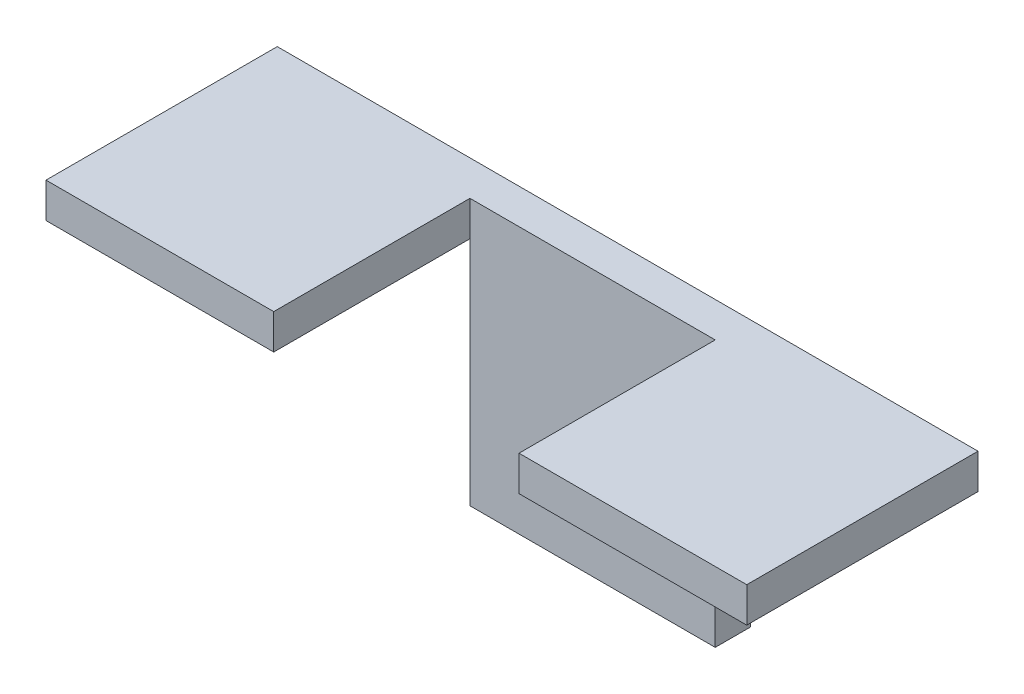
ISO-10303-21;
HEADER;
FILE_DESCRIPTION(('STEP AP214'),'2;1');
FILE_NAME('part.step','',(''),(''),'','','');
FILE_SCHEMA(('AUTOMOTIVE_DESIGN { 1 0 10303 214 1 1 1 1 }'));
ENDSEC;
DATA;
#1=APPLICATION_CONTEXT('core data for automotive mechanical design processes');
#2=APPLICATION_PROTOCOL_DEFINITION('international standard','automotive_design',2000,#1);
#3=PRODUCT_CONTEXT('',#1,'mechanical');
#4=PRODUCT('Part','Part','',(#3));
#5=PRODUCT_RELATED_PRODUCT_CATEGORY('part','',(#4));
#6=PRODUCT_DEFINITION_FORMATION('','',#4);
#7=PRODUCT_DEFINITION_CONTEXT('part definition',#1,'design');
#8=PRODUCT_DEFINITION('design','',#6,#7);
#9=PRODUCT_DEFINITION_SHAPE('','',#8);
#10=(LENGTH_UNIT() NAMED_UNIT(*) SI_UNIT(.MILLI.,.METRE.));
#11=(NAMED_UNIT(*) PLANE_ANGLE_UNIT() SI_UNIT($,.RADIAN.));
#12=(NAMED_UNIT(*) SI_UNIT($,.STERADIAN.) SOLID_ANGLE_UNIT());
#13=UNCERTAINTY_MEASURE_WITH_UNIT(LENGTH_MEASURE(1.E-05),#10,'distance_accuracy_value','');
#14=(GEOMETRIC_REPRESENTATION_CONTEXT(3) GLOBAL_UNCERTAINTY_ASSIGNED_CONTEXT((#13)) GLOBAL_UNIT_ASSIGNED_CONTEXT((#10,
#11,#12)) REPRESENTATION_CONTEXT('',''));
#15=CARTESIAN_POINT('',(0.,0.,0.));
#16=DIRECTION('',(0.,0.,1.));
#17=DIRECTION('',(1.,0.,0.));
#18=AXIS2_PLACEMENT_3D('',#15,#16,#17);
#19=CARTESIAN_POINT('',(51.435,-25.146,0.));
#20=DIRECTION('',(1.,0.,0.));
#21=DIRECTION('',(0.,0.,-1.));
#22=AXIS2_PLACEMENT_3D('',#19,#20,#21);
#23=PLANE('',#22);
#24=DIRECTION('',(0.,1.,0.));
#25=VECTOR('',#24,1.);
#26=CARTESIAN_POINT('',(51.435,-25.146,0.));
#27=LINE('',#26,#25);
#28=CARTESIAN_POINT('',(51.435,-25.146,0.));
#29=VERTEX_POINT('',#28);
#30=CARTESIAN_POINT('',(51.435,0.,0.));
#31=VERTEX_POINT('',#30);
#32=EDGE_CURVE('E129',#29,#31,#27,.T.);
#33=ORIENTED_EDGE('',*,*,#32,.T.);
#34=DIRECTION('',(0.,0.,1.));
#35=VECTOR('',#34,1.);
#36=CARTESIAN_POINT('',(51.435,0.,0.));
#37=LINE('',#36,#35);
#38=CARTESIAN_POINT('',(51.435,0.,3.81));
#39=VERTEX_POINT('',#38);
#40=EDGE_CURVE('E116',#31,#39,#37,.T.);
#41=ORIENTED_EDGE('',*,*,#40,.T.);
#42=DIRECTION('',(0.,1.,0.));
#43=VECTOR('',#42,1.);
#44=CARTESIAN_POINT('',(51.435,-25.146,3.81));
#45=LINE('',#44,#43);
#46=CARTESIAN_POINT('',(51.435,-25.146,3.81));
#47=VERTEX_POINT('',#46);
#48=EDGE_CURVE('E141',#47,#39,#45,.T.);
#49=ORIENTED_EDGE('',*,*,#48,.F.);
#50=DIRECTION('',(0.,0.,-1.));
#51=VECTOR('',#50,1.);
#52=CARTESIAN_POINT('',(51.435,-25.146,0.));
#53=LINE('',#52,#51);
#54=EDGE_CURVE('E138',#47,#29,#53,.T.);
#55=ORIENTED_EDGE('',*,*,#54,.T.);
#56=EDGE_LOOP('',(#33,#41,#49,#55));
#57=FACE_BOUND('',#56,.T.);
#58=ADVANCED_FACE('F32',(#57),#23,.T.);
#59=CARTESIAN_POINT('',(24.765,3.81,0.));
#60=DIRECTION('',(1.,0.,0.));
#61=DIRECTION('',(0.,0.,-1.));
#62=AXIS2_PLACEMENT_3D('',#59,#60,#61);
#63=PLANE('',#62);
#64=DIRECTION('',(0.,0.,1.));
#65=VECTOR('',#64,1.);
#66=CARTESIAN_POINT('',(24.765,0.,0.));
#67=LINE('',#66,#65);
#68=CARTESIAN_POINT('',(24.765,0.,3.81));
#69=VERTEX_POINT('',#68);
#70=CARTESIAN_POINT('',(24.765,0.,25.146));
#71=VERTEX_POINT('',#70);
#72=EDGE_CURVE('E169',#69,#71,#67,.T.);
#73=ORIENTED_EDGE('',*,*,#72,.F.);
#74=DIRECTION('',(0.,1.,0.));
#75=VECTOR('',#74,1.);
#76=CARTESIAN_POINT('',(24.765,-25.146,3.81));
#77=LINE('',#76,#75);
#78=CARTESIAN_POINT('',(24.765,3.81,3.81));
#79=VERTEX_POINT('',#78);
#80=EDGE_CURVE('E11',#69,#79,#77,.T.);
#81=ORIENTED_EDGE('',*,*,#80,.T.);
#82=DIRECTION('',(0.,0.,1.));
#83=VECTOR('',#82,1.);
#84=CARTESIAN_POINT('',(24.765,3.81,0.));
#85=LINE('',#84,#83);
#86=CARTESIAN_POINT('',(24.765,3.81,25.146));
#87=VERTEX_POINT('',#86);
#88=EDGE_CURVE('E159',#79,#87,#85,.T.);
#89=ORIENTED_EDGE('',*,*,#88,.T.);
#90=DIRECTION('',(0.,-1.,0.));
#91=VECTOR('',#90,1.);
#92=CARTESIAN_POINT('',(24.765,3.81,25.146));
#93=LINE('',#92,#91);
#94=EDGE_CURVE('E175',#87,#71,#93,.T.);
#95=ORIENTED_EDGE('',*,*,#94,.T.);
#96=EDGE_LOOP('',(#73,#81,#89,#95));
#97=FACE_BOUND('',#96,.T.);
#98=ADVANCED_FACE('F233',(#97),#63,.T.);
#99=CARTESIAN_POINT('',(0.,3.81,0.));
#100=DIRECTION('',(1.,0.,0.));
#101=DIRECTION('',(0.,0.,-1.));
#102=AXIS2_PLACEMENT_3D('',#99,#100,#101);
#103=PLANE('',#102);
#104=DIRECTION('',(0.,0.,1.));
#105=VECTOR('',#104,1.);
#106=CARTESIAN_POINT('',(0.,0.,0.));
#107=LINE('',#106,#105);
#108=CARTESIAN_POINT('',(0.,0.,0.));
#109=VERTEX_POINT('',#108);
#110=CARTESIAN_POINT('',(0.,0.,25.146));
#111=VERTEX_POINT('',#110);
#112=EDGE_CURVE('E144',#109,#111,#107,.T.);
#113=ORIENTED_EDGE('',*,*,#112,.T.);
#114=DIRECTION('',(0.,-1.,0.));
#115=VECTOR('',#114,1.);
#116=CARTESIAN_POINT('',(0.,3.81,25.146));
#117=LINE('',#116,#115);
#118=CARTESIAN_POINT('',(0.,3.81,25.146));
#119=VERTEX_POINT('',#118);
#120=EDGE_CURVE('E36',#119,#111,#117,.T.);
#121=ORIENTED_EDGE('',*,*,#120,.F.);
#122=DIRECTION('',(0.,0.,1.));
#123=VECTOR('',#122,1.);
#124=CARTESIAN_POINT('',(0.,3.81,0.));
#125=LINE('',#124,#123);
#126=CARTESIAN_POINT('',(0.,3.81,0.));
#127=VERTEX_POINT('',#126);
#128=EDGE_CURVE('E152',#127,#119,#125,.T.);
#129=ORIENTED_EDGE('',*,*,#128,.F.);
#130=DIRECTION('',(0.,-1.,0.));
#131=VECTOR('',#130,1.);
#132=CARTESIAN_POINT('',(0.,3.81,0.));
#133=LINE('',#132,#131);
#134=EDGE_CURVE('E163',#127,#109,#133,.T.);
#135=ORIENTED_EDGE('',*,*,#134,.T.);
#136=EDGE_LOOP('',(#113,#121,#129,#135));
#137=FACE_BOUND('',#136,.T.);
#138=ADVANCED_FACE('F34',(#137),#103,.F.);
#139=CARTESIAN_POINT('',(0.,3.81,25.146));
#140=DIRECTION('',(0.,0.,-1.));
#141=DIRECTION('',(-1.,0.,0.));
#142=AXIS2_PLACEMENT_3D('',#139,#140,#141);
#143=PLANE('',#142);
#144=DIRECTION('',(1.,0.,0.));
#145=VECTOR('',#144,1.);
#146=CARTESIAN_POINT('',(0.,0.,25.146));
#147=LINE('',#146,#145);
#148=EDGE_CURVE('E166',#111,#71,#147,.T.);
#149=ORIENTED_EDGE('',*,*,#148,.T.);
#150=ORIENTED_EDGE('',*,*,#94,.F.);
#151=DIRECTION('',(1.,0.,0.));
#152=VECTOR('',#151,1.);
#153=CARTESIAN_POINT('',(0.,3.81,25.146));
#154=LINE('',#153,#152);
#155=EDGE_CURVE('E155',#119,#87,#154,.T.);
#156=ORIENTED_EDGE('',*,*,#155,.F.);
#157=ORIENTED_EDGE('',*,*,#120,.T.);
#158=EDGE_LOOP('',(#149,#150,#156,#157));
#159=FACE_BOUND('',#158,.T.);
#160=ADVANCED_FACE('F183',(#159),#143,.F.);
#161=CARTESIAN_POINT('',(0.,3.81,0.));
#162=DIRECTION('',(0.,0.,-1.));
#163=DIRECTION('',(-1.,0.,0.));
#164=AXIS2_PLACEMENT_3D('',#161,#162,#163);
#165=PLANE('',#164);
#166=DIRECTION('',(1.,0.,0.));
#167=VECTOR('',#166,1.);
#168=CARTESIAN_POINT('',(0.,0.,0.));
#169=LINE('',#168,#167);
#170=CARTESIAN_POINT('',(24.765,0.,0.));
#171=VERTEX_POINT('',#170);
#172=EDGE_CURVE('E156',#109,#171,#169,.T.);
#173=ORIENTED_EDGE('',*,*,#172,.F.);
#174=ORIENTED_EDGE('',*,*,#134,.F.);
#175=DIRECTION('',(1.,0.,0.));
#176=VECTOR('',#175,1.);
#177=CARTESIAN_POINT('',(0.,3.81,0.));
#178=LINE('',#177,#176);
#179=CARTESIAN_POINT('',(76.2,3.81,0.));
#180=VERTEX_POINT('',#179);
#181=EDGE_CURVE('E161',#127,#180,#178,.T.);
#182=ORIENTED_EDGE('',*,*,#181,.T.);
#183=DIRECTION('',(0.,-1.,0.));
#184=VECTOR('',#183,1.);
#185=CARTESIAN_POINT('',(76.2,3.81,0.));
#186=LINE('',#185,#184);
#187=CARTESIAN_POINT('',(76.2,0.,0.));
#188=VERTEX_POINT('',#187);
#189=EDGE_CURVE('E132',#180,#188,#186,.T.);
#190=ORIENTED_EDGE('',*,*,#189,.T.);
#191=DIRECTION('',(1.,0.,0.));
#192=VECTOR('',#191,1.);
#193=CARTESIAN_POINT('',(51.435,0.,0.));
#194=LINE('',#193,#192);
#195=EDGE_CURVE('E120',#31,#188,#194,.T.);
#196=ORIENTED_EDGE('',*,*,#195,.F.);
#197=ORIENTED_EDGE('',*,*,#32,.F.);
#198=DIRECTION('',(-1.,0.,0.));
#199=VECTOR('',#198,1.);
#200=CARTESIAN_POINT('',(24.765,-25.146,0.));
#201=LINE('',#200,#199);
#202=CARTESIAN_POINT('',(24.765,-25.146,0.));
#203=VERTEX_POINT('',#202);
#204=EDGE_CURVE('E151',#29,#203,#201,.T.);
#205=ORIENTED_EDGE('',*,*,#204,.T.);
#206=DIRECTION('',(0.,1.,0.));
#207=VECTOR('',#206,1.);
#208=CARTESIAN_POINT('',(24.765,-25.146,0.));
#209=LINE('',#208,#207);
#210=EDGE_CURVE('E140',#203,#171,#209,.T.);
#211=ORIENTED_EDGE('',*,*,#210,.T.);
#212=EDGE_LOOP('',(#173,#174,#182,#190,#196,#197,#205,#211));
#213=FACE_BOUND('',#212,.T.);
#214=ADVANCED_FACE('F127',(#213),#165,.T.);
#215=CARTESIAN_POINT('',(0.,3.81,0.));
#216=DIRECTION('',(0.,1.,0.));
#217=DIRECTION('',(0.,0.,1.));
#218=AXIS2_PLACEMENT_3D('',#215,#216,#217);
#219=PLANE('',#218);
#220=ORIENTED_EDGE('',*,*,#128,.T.);
#221=ORIENTED_EDGE('',*,*,#155,.T.);
#222=ORIENTED_EDGE('',*,*,#88,.F.);
#223=DIRECTION('',(1.,0.,0.));
#224=VECTOR('',#223,1.);
#225=CARTESIAN_POINT('',(24.765,3.81,3.81));
#226=LINE('',#225,#224);
#227=CARTESIAN_POINT('',(51.435,3.81,3.81));
#228=VERTEX_POINT('',#227);
#229=EDGE_CURVE('E57',#79,#228,#226,.T.);
#230=ORIENTED_EDGE('',*,*,#229,.T.);
#231=DIRECTION('',(0.,0.,1.));
#232=VECTOR('',#231,1.);
#233=CARTESIAN_POINT('',(51.435,3.81,0.));
#234=LINE('',#233,#232);
#235=CARTESIAN_POINT('',(51.435,3.81,25.146));
#236=VERTEX_POINT('',#235);
#237=EDGE_CURVE('E135',#228,#236,#234,.T.);
#238=ORIENTED_EDGE('',*,*,#237,.T.);
#239=DIRECTION('',(1.,0.,0.));
#240=VECTOR('',#239,1.);
#241=CARTESIAN_POINT('',(51.435,3.81,25.146));
#242=LINE('',#241,#240);
#243=CARTESIAN_POINT('',(76.2,3.81,25.146));
#244=VERTEX_POINT('',#243);
#245=EDGE_CURVE('E205',#236,#244,#242,.T.);
#246=ORIENTED_EDGE('',*,*,#245,.T.);
#247=DIRECTION('',(0.,0.,1.));
#248=VECTOR('',#247,1.);
#249=CARTESIAN_POINT('',(76.2,3.81,0.));
#250=LINE('',#249,#248);
#251=EDGE_CURVE('E207',#180,#244,#250,.T.);
#252=ORIENTED_EDGE('',*,*,#251,.F.);
#253=ORIENTED_EDGE('',*,*,#181,.F.);
#254=EDGE_LOOP('',(#220,#221,#222,#230,#238,#246,#252,#253));
#255=FACE_BOUND('',#254,.T.);
#256=ADVANCED_FACE('F231',(#255),#219,.T.);
#257=CARTESIAN_POINT('',(0.,0.,0.));
#258=DIRECTION('',(0.,1.,0.));
#259=DIRECTION('',(0.,0.,1.));
#260=AXIS2_PLACEMENT_3D('',#257,#258,#259);
#261=PLANE('',#260);
#262=ORIENTED_EDGE('',*,*,#112,.F.);
#263=ORIENTED_EDGE('',*,*,#172,.T.);
#264=EDGE_CURVE('E170',#171,#69,#67,.T.);
#265=ORIENTED_EDGE('',*,*,#264,.T.);
#266=ORIENTED_EDGE('',*,*,#72,.T.);
#267=ORIENTED_EDGE('',*,*,#148,.F.);
#268=EDGE_LOOP('',(#262,#263,#265,#266,#267));
#269=FACE_BOUND('',#268,.T.);
#270=ADVANCED_FACE('F188',(#269),#261,.F.);
#271=CARTESIAN_POINT('',(24.765,-25.146,0.));
#272=DIRECTION('',(-1.,0.,0.));
#273=DIRECTION('',(0.,0.,1.));
#274=AXIS2_PLACEMENT_3D('',#271,#272,#273);
#275=PLANE('',#274);
#276=ORIENTED_EDGE('',*,*,#264,.F.);
#277=ORIENTED_EDGE('',*,*,#210,.F.);
#278=DIRECTION('',(0.,0.,1.));
#279=VECTOR('',#278,1.);
#280=CARTESIAN_POINT('',(24.765,-25.146,0.));
#281=LINE('',#280,#279);
#282=CARTESIAN_POINT('',(24.765,-25.146,3.81));
#283=VERTEX_POINT('',#282);
#284=EDGE_CURVE('E193',#203,#283,#281,.T.);
#285=ORIENTED_EDGE('',*,*,#284,.T.);
#286=EDGE_CURVE('E42',#283,#69,#77,.T.);
#287=ORIENTED_EDGE('',*,*,#286,.T.);
#288=EDGE_LOOP('',(#276,#277,#285,#287));
#289=FACE_BOUND('',#288,.T.);
#290=ADVANCED_FACE('F192',(#289),#275,.T.);
#291=CARTESIAN_POINT('',(24.765,-25.146,3.81));
#292=DIRECTION('',(0.,0.,1.));
#293=DIRECTION('',(1.,0.,0.));
#294=AXIS2_PLACEMENT_3D('',#291,#292,#293);
#295=PLANE('',#294);
#296=ORIENTED_EDGE('',*,*,#229,.F.);
#297=ORIENTED_EDGE('',*,*,#80,.F.);
#298=ORIENTED_EDGE('',*,*,#286,.F.);
#299=DIRECTION('',(1.,0.,0.));
#300=VECTOR('',#299,1.);
#301=CARTESIAN_POINT('',(24.765,-25.146,3.81));
#302=LINE('',#301,#300);
#303=EDGE_CURVE('E198',#283,#47,#302,.T.);
#304=ORIENTED_EDGE('',*,*,#303,.T.);
#305=ORIENTED_EDGE('',*,*,#48,.T.);
#306=EDGE_CURVE('E146',#39,#228,#45,.T.);
#307=ORIENTED_EDGE('',*,*,#306,.T.);
#308=EDGE_LOOP('',(#296,#297,#298,#304,#305,#307));
#309=FACE_BOUND('',#308,.T.);
#310=ADVANCED_FACE('F234',(#309),#295,.T.);
#311=CARTESIAN_POINT('',(0.,-25.146,0.));
#312=DIRECTION('',(0.,1.,0.));
#313=DIRECTION('',(0.,0.,1.));
#314=AXIS2_PLACEMENT_3D('',#311,#312,#313);
#315=PLANE('',#314);
#316=ORIENTED_EDGE('',*,*,#284,.F.);
#317=ORIENTED_EDGE('',*,*,#204,.F.);
#318=ORIENTED_EDGE('',*,*,#54,.F.);
#319=ORIENTED_EDGE('',*,*,#303,.F.);
#320=EDGE_LOOP('',(#316,#317,#318,#319));
#321=FACE_BOUND('',#320,.T.);
#322=ADVANCED_FACE('F196',(#321),#315,.F.);
#323=CARTESIAN_POINT('',(51.435,3.81,0.));
#324=DIRECTION('',(1.,0.,0.));
#325=DIRECTION('',(0.,0.,-1.));
#326=AXIS2_PLACEMENT_3D('',#323,#324,#325);
#327=PLANE('',#326);
#328=ORIENTED_EDGE('',*,*,#306,.F.);
#329=CARTESIAN_POINT('',(51.435,0.,25.146));
#330=VERTEX_POINT('',#329);
#331=EDGE_CURVE('E49',#39,#330,#37,.T.);
#332=ORIENTED_EDGE('',*,*,#331,.T.);
#333=DIRECTION('',(0.,-1.,0.));
#334=VECTOR('',#333,1.);
#335=CARTESIAN_POINT('',(51.435,3.81,25.146));
#336=LINE('',#335,#334);
#337=EDGE_CURVE('E217',#236,#330,#336,.T.);
#338=ORIENTED_EDGE('',*,*,#337,.F.);
#339=ORIENTED_EDGE('',*,*,#237,.F.);
#340=EDGE_LOOP('',(#328,#332,#338,#339));
#341=FACE_BOUND('',#340,.T.);
#342=ADVANCED_FACE('F225',(#341),#327,.F.);
#343=CARTESIAN_POINT('',(51.435,3.81,25.146));
#344=DIRECTION('',(0.,0.,-1.));
#345=DIRECTION('',(-1.,0.,0.));
#346=AXIS2_PLACEMENT_3D('',#343,#344,#345);
#347=PLANE('',#346);
#348=DIRECTION('',(1.,0.,0.));
#349=VECTOR('',#348,1.);
#350=CARTESIAN_POINT('',(51.435,0.,25.146));
#351=LINE('',#350,#349);
#352=CARTESIAN_POINT('',(76.2,0.,25.146));
#353=VERTEX_POINT('',#352);
#354=EDGE_CURVE('E210',#330,#353,#351,.T.);
#355=ORIENTED_EDGE('',*,*,#354,.T.);
#356=DIRECTION('',(0.,-1.,0.));
#357=VECTOR('',#356,1.);
#358=CARTESIAN_POINT('',(76.2,3.81,25.146));
#359=LINE('',#358,#357);
#360=EDGE_CURVE('E215',#244,#353,#359,.T.);
#361=ORIENTED_EDGE('',*,*,#360,.F.);
#362=ORIENTED_EDGE('',*,*,#245,.F.);
#363=ORIENTED_EDGE('',*,*,#337,.T.);
#364=EDGE_LOOP('',(#355,#361,#362,#363));
#365=FACE_BOUND('',#364,.T.);
#366=ADVANCED_FACE('F222',(#365),#347,.F.);
#367=CARTESIAN_POINT('',(76.2,3.81,0.));
#368=DIRECTION('',(1.,0.,0.));
#369=DIRECTION('',(0.,0.,-1.));
#370=AXIS2_PLACEMENT_3D('',#367,#368,#369);
#371=PLANE('',#370);
#372=DIRECTION('',(0.,0.,1.));
#373=VECTOR('',#372,1.);
#374=CARTESIAN_POINT('',(76.2,0.,0.));
#375=LINE('',#374,#373);
#376=EDGE_CURVE('E134',#188,#353,#375,.T.);
#377=ORIENTED_EDGE('',*,*,#376,.F.);
#378=ORIENTED_EDGE('',*,*,#189,.F.);
#379=ORIENTED_EDGE('',*,*,#251,.T.);
#380=ORIENTED_EDGE('',*,*,#360,.T.);
#381=EDGE_LOOP('',(#377,#378,#379,#380));
#382=FACE_BOUND('',#381,.T.);
#383=ADVANCED_FACE('F227',(#382),#371,.T.);
#384=CARTESIAN_POINT('',(0.,0.,0.));
#385=DIRECTION('',(0.,1.,0.));
#386=DIRECTION('',(0.,0.,1.));
#387=AXIS2_PLACEMENT_3D('',#384,#385,#386);
#388=PLANE('',#387);
#389=ORIENTED_EDGE('',*,*,#40,.F.);
#390=ORIENTED_EDGE('',*,*,#195,.T.);
#391=ORIENTED_EDGE('',*,*,#376,.T.);
#392=ORIENTED_EDGE('',*,*,#354,.F.);
#393=ORIENTED_EDGE('',*,*,#331,.F.);
#394=EDGE_LOOP('',(#389,#390,#391,#392,#393));
#395=FACE_BOUND('',#394,.T.);
#396=ADVANCED_FACE('F118',(#395),#388,.F.);
#397=CLOSED_SHELL('',(#58,#98,#138,#160,#214,#256,#270,#290,#310,#322,#342,#366,#383,#396));
#398=MANIFOLD_SOLID_BREP('B2',#397);
#399=ADVANCED_BREP_SHAPE_REPRESENTATION('',(#18,#398),#14);
#400=SHAPE_DEFINITION_REPRESENTATION(#9,#399);
ENDSEC;
END-ISO-10303-21;
